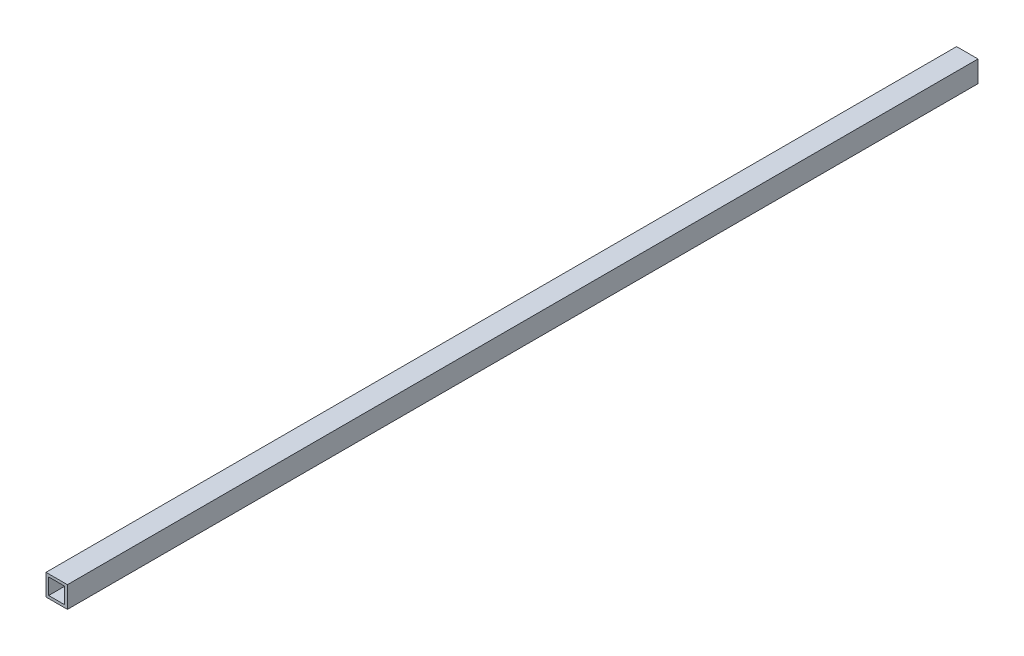
ISO-10303-21;
HEADER;
FILE_DESCRIPTION(('STEP AP214'),'2;1');
FILE_NAME('part.step','',(''),(''),'','','');
FILE_SCHEMA(('AUTOMOTIVE_DESIGN { 1 0 10303 214 1 1 1 1 }'));
ENDSEC;
DATA;
#1=APPLICATION_CONTEXT('core data for automotive mechanical design processes');
#2=APPLICATION_PROTOCOL_DEFINITION('international standard','automotive_design',2000,#1);
#3=PRODUCT_CONTEXT('',#1,'mechanical');
#4=PRODUCT('Part','Part','',(#3));
#5=PRODUCT_RELATED_PRODUCT_CATEGORY('part','',(#4));
#6=PRODUCT_DEFINITION_FORMATION('','',#4);
#7=PRODUCT_DEFINITION_CONTEXT('part definition',#1,'design');
#8=PRODUCT_DEFINITION('design','',#6,#7);
#9=PRODUCT_DEFINITION_SHAPE('','',#8);
#10=(LENGTH_UNIT() NAMED_UNIT(*) SI_UNIT(.MILLI.,.METRE.));
#11=(NAMED_UNIT(*) PLANE_ANGLE_UNIT() SI_UNIT($,.RADIAN.));
#12=(NAMED_UNIT(*) SI_UNIT($,.STERADIAN.) SOLID_ANGLE_UNIT());
#13=UNCERTAINTY_MEASURE_WITH_UNIT(LENGTH_MEASURE(1.E-05),#10,'distance_accuracy_value','');
#14=(GEOMETRIC_REPRESENTATION_CONTEXT(3) GLOBAL_UNCERTAINTY_ASSIGNED_CONTEXT((#13)) GLOBAL_UNIT_ASSIGNED_CONTEXT((#10,
#11,#12)) REPRESENTATION_CONTEXT('',''));
#15=CARTESIAN_POINT('',(0.,0.,0.));
#16=DIRECTION('',(0.,0.,1.));
#17=DIRECTION('',(1.,0.,0.));
#18=AXIS2_PLACEMENT_3D('',#15,#16,#17);
#19=CARTESIAN_POINT('',(-20.,-20.,1700.));
#20=DIRECTION('',(1.,0.,0.));
#21=DIRECTION('',(0.,0.,-1.));
#22=AXIS2_PLACEMENT_3D('',#19,#20,#21);
#23=PLANE('',#22);
#24=DIRECTION('',(0.,-1.,0.));
#25=VECTOR('',#24,1.);
#26=CARTESIAN_POINT('',(-20.,-20.,0.));
#27=LINE('',#26,#25);
#28=CARTESIAN_POINT('',(-20.,20.,0.));
#29=VERTEX_POINT('',#28);
#30=CARTESIAN_POINT('',(-20.,-20.,0.));
#31=VERTEX_POINT('',#30);
#32=EDGE_CURVE('E144',#29,#31,#27,.T.);
#33=ORIENTED_EDGE('',*,*,#32,.T.);
#34=DIRECTION('',(0.,0.,-1.));
#35=VECTOR('',#34,1.);
#36=CARTESIAN_POINT('',(-20.,-20.,1700.));
#37=LINE('',#36,#35);
#38=CARTESIAN_POINT('',(-20.,-20.,1700.));
#39=VERTEX_POINT('',#38);
#40=EDGE_CURVE('E11',#39,#31,#37,.T.);
#41=ORIENTED_EDGE('',*,*,#40,.F.);
#42=DIRECTION('',(0.,-1.,0.));
#43=VECTOR('',#42,1.);
#44=CARTESIAN_POINT('',(-20.,-20.,1700.));
#45=LINE('',#44,#43);
#46=CARTESIAN_POINT('',(-20.,20.,1700.));
#47=VERTEX_POINT('',#46);
#48=EDGE_CURVE('E133',#47,#39,#45,.T.);
#49=ORIENTED_EDGE('',*,*,#48,.F.);
#50=DIRECTION('',(0.,0.,-1.));
#51=VECTOR('',#50,1.);
#52=CARTESIAN_POINT('',(-20.,20.,1700.));
#53=LINE('',#52,#51);
#54=EDGE_CURVE('E143',#47,#29,#53,.T.);
#55=ORIENTED_EDGE('',*,*,#54,.T.);
#56=EDGE_LOOP('',(#33,#41,#49,#55));
#57=FACE_BOUND('',#56,.T.);
#58=ADVANCED_FACE('F36',(#57),#23,.F.);
#59=CARTESIAN_POINT('',(20.,-20.,1700.));
#60=DIRECTION('',(0.,1.,0.));
#61=DIRECTION('',(-1.,0.,0.));
#62=AXIS2_PLACEMENT_3D('',#59,#60,#61);
#63=PLANE('',#62);
#64=DIRECTION('',(1.,0.,0.));
#65=VECTOR('',#64,1.);
#66=CARTESIAN_POINT('',(20.,-20.,0.));
#67=LINE('',#66,#65);
#68=CARTESIAN_POINT('',(20.,-20.,0.));
#69=VERTEX_POINT('',#68);
#70=EDGE_CURVE('E147',#31,#69,#67,.T.);
#71=ORIENTED_EDGE('',*,*,#70,.T.);
#72=DIRECTION('',(0.,0.,-1.));
#73=VECTOR('',#72,1.);
#74=CARTESIAN_POINT('',(20.,-20.,1700.));
#75=LINE('',#74,#73);
#76=CARTESIAN_POINT('',(20.,-20.,1700.));
#77=VERTEX_POINT('',#76);
#78=EDGE_CURVE('E43',#77,#69,#75,.T.);
#79=ORIENTED_EDGE('',*,*,#78,.F.);
#80=DIRECTION('',(1.,0.,0.));
#81=VECTOR('',#80,1.);
#82=CARTESIAN_POINT('',(20.,-20.,1700.));
#83=LINE('',#82,#81);
#84=EDGE_CURVE('E136',#39,#77,#83,.T.);
#85=ORIENTED_EDGE('',*,*,#84,.F.);
#86=ORIENTED_EDGE('',*,*,#40,.T.);
#87=EDGE_LOOP('',(#71,#79,#85,#86));
#88=FACE_BOUND('',#87,.T.);
#89=ADVANCED_FACE('F175',(#88),#63,.F.);
#90=CARTESIAN_POINT('',(20.,-20.,1700.));
#91=DIRECTION('',(-1.,0.,0.));
#92=DIRECTION('',(0.,0.,1.));
#93=AXIS2_PLACEMENT_3D('',#90,#91,#92);
#94=PLANE('',#93);
#95=DIRECTION('',(0.,1.,0.));
#96=VECTOR('',#95,1.);
#97=CARTESIAN_POINT('',(20.,-20.,0.));
#98=LINE('',#97,#96);
#99=CARTESIAN_POINT('',(20.,20.,0.));
#100=VERTEX_POINT('',#99);
#101=EDGE_CURVE('E149',#69,#100,#98,.T.);
#102=ORIENTED_EDGE('',*,*,#101,.T.);
#103=DIRECTION('',(0.,0.,-1.));
#104=VECTOR('',#103,1.);
#105=CARTESIAN_POINT('',(20.,20.,1700.));
#106=LINE('',#105,#104);
#107=CARTESIAN_POINT('',(20.,20.,1700.));
#108=VERTEX_POINT('',#107);
#109=EDGE_CURVE('E154',#108,#100,#106,.T.);
#110=ORIENTED_EDGE('',*,*,#109,.F.);
#111=DIRECTION('',(0.,1.,0.));
#112=VECTOR('',#111,1.);
#113=CARTESIAN_POINT('',(20.,-20.,1700.));
#114=LINE('',#113,#112);
#115=EDGE_CURVE('E139',#77,#108,#114,.T.);
#116=ORIENTED_EDGE('',*,*,#115,.F.);
#117=ORIENTED_EDGE('',*,*,#78,.T.);
#118=EDGE_LOOP('',(#102,#110,#116,#117));
#119=FACE_BOUND('',#118,.T.);
#120=ADVANCED_FACE('F161',(#119),#94,.F.);
#121=CARTESIAN_POINT('',(20.,20.,1700.));
#122=DIRECTION('',(0.,-1.,0.));
#123=DIRECTION('',(1.,0.,0.));
#124=AXIS2_PLACEMENT_3D('',#121,#122,#123);
#125=PLANE('',#124);
#126=DIRECTION('',(-1.,0.,0.));
#127=VECTOR('',#126,1.);
#128=CARTESIAN_POINT('',(20.,20.,0.));
#129=LINE('',#128,#127);
#130=EDGE_CURVE('E137',#100,#29,#129,.T.);
#131=ORIENTED_EDGE('',*,*,#130,.T.);
#132=ORIENTED_EDGE('',*,*,#54,.F.);
#133=DIRECTION('',(-1.,0.,0.));
#134=VECTOR('',#133,1.);
#135=CARTESIAN_POINT('',(20.,20.,1700.));
#136=LINE('',#135,#134);
#137=EDGE_CURVE('E141',#108,#47,#136,.T.);
#138=ORIENTED_EDGE('',*,*,#137,.F.);
#139=ORIENTED_EDGE('',*,*,#109,.T.);
#140=EDGE_LOOP('',(#131,#132,#138,#139));
#141=FACE_BOUND('',#140,.T.);
#142=ADVANCED_FACE('F168',(#141),#125,.F.);
#143=CARTESIAN_POINT('',(0.,0.,1700.));
#144=DIRECTION('',(0.,0.,1.));
#145=DIRECTION('',(1.,0.,0.));
#146=AXIS2_PLACEMENT_3D('',#143,#144,#145);
#147=PLANE('',#146);
#148=DIRECTION('',(0.,-1.,0.));
#149=VECTOR('',#148,1.);
#150=CARTESIAN_POINT('',(-15.,-20.,1700.));
#151=LINE('',#150,#149);
#152=CARTESIAN_POINT('',(-15.,15.,1700.));
#153=VERTEX_POINT('',#152);
#154=CARTESIAN_POINT('',(-15.,-15.,1700.));
#155=VERTEX_POINT('',#154);
#156=EDGE_CURVE('E121',#153,#155,#151,.T.);
#157=ORIENTED_EDGE('',*,*,#156,.F.);
#158=DIRECTION('',(-1.,0.,0.));
#159=VECTOR('',#158,1.);
#160=CARTESIAN_POINT('',(20.,15.,1700.));
#161=LINE('',#160,#159);
#162=CARTESIAN_POINT('',(15.,15.,1700.));
#163=VERTEX_POINT('',#162);
#164=EDGE_CURVE('E105',#163,#153,#161,.T.);
#165=ORIENTED_EDGE('',*,*,#164,.F.);
#166=DIRECTION('',(0.,1.,0.));
#167=VECTOR('',#166,1.);
#168=CARTESIAN_POINT('',(15.,-20.,1700.));
#169=LINE('',#168,#167);
#170=CARTESIAN_POINT('',(15.,-15.,1700.));
#171=VERTEX_POINT('',#170);
#172=EDGE_CURVE('E130',#171,#163,#169,.T.);
#173=ORIENTED_EDGE('',*,*,#172,.F.);
#174=DIRECTION('',(1.,0.,0.));
#175=VECTOR('',#174,1.);
#176=CARTESIAN_POINT('',(20.,-15.,1700.));
#177=LINE('',#176,#175);
#178=EDGE_CURVE('E123',#155,#171,#177,.T.);
#179=ORIENTED_EDGE('',*,*,#178,.F.);
#180=EDGE_LOOP('',(#157,#165,#173,#179));
#181=FACE_BOUND('',#180,.T.);
#182=ORIENTED_EDGE('',*,*,#48,.T.);
#183=ORIENTED_EDGE('',*,*,#84,.T.);
#184=ORIENTED_EDGE('',*,*,#115,.T.);
#185=ORIENTED_EDGE('',*,*,#137,.T.);
#186=EDGE_LOOP('',(#182,#183,#184,#185));
#187=FACE_BOUND('',#186,.T.);
#188=ADVANCED_FACE('F174',(#181,#187),#147,.T.);
#189=CARTESIAN_POINT('',(0.,0.,0.));
#190=DIRECTION('',(0.,0.,1.));
#191=DIRECTION('',(1.,0.,0.));
#192=AXIS2_PLACEMENT_3D('',#189,#190,#191);
#193=PLANE('',#192);
#194=DIRECTION('',(-1.,0.,0.));
#195=VECTOR('',#194,1.);
#196=CARTESIAN_POINT('',(20.,15.,0.));
#197=LINE('',#196,#195);
#198=CARTESIAN_POINT('',(15.,15.,0.));
#199=VERTEX_POINT('',#198);
#200=CARTESIAN_POINT('',(-15.,15.,0.));
#201=VERTEX_POINT('',#200);
#202=EDGE_CURVE('E103',#199,#201,#197,.T.);
#203=ORIENTED_EDGE('',*,*,#202,.T.);
#204=DIRECTION('',(0.,-1.,0.));
#205=VECTOR('',#204,1.);
#206=CARTESIAN_POINT('',(-15.,-20.,0.));
#207=LINE('',#206,#205);
#208=CARTESIAN_POINT('',(-15.,-15.,0.));
#209=VERTEX_POINT('',#208);
#210=EDGE_CURVE('E111',#201,#209,#207,.T.);
#211=ORIENTED_EDGE('',*,*,#210,.T.);
#212=DIRECTION('',(1.,0.,0.));
#213=VECTOR('',#212,1.);
#214=CARTESIAN_POINT('',(20.,-15.,0.));
#215=LINE('',#214,#213);
#216=CARTESIAN_POINT('',(15.,-15.,0.));
#217=VERTEX_POINT('',#216);
#218=EDGE_CURVE('E117',#209,#217,#215,.T.);
#219=ORIENTED_EDGE('',*,*,#218,.T.);
#220=DIRECTION('',(0.,1.,0.));
#221=VECTOR('',#220,1.);
#222=CARTESIAN_POINT('',(15.,-20.,0.));
#223=LINE('',#222,#221);
#224=EDGE_CURVE('E57',#217,#199,#223,.T.);
#225=ORIENTED_EDGE('',*,*,#224,.T.);
#226=EDGE_LOOP('',(#203,#211,#219,#225));
#227=FACE_BOUND('',#226,.T.);
#228=ORIENTED_EDGE('',*,*,#32,.F.);
#229=ORIENTED_EDGE('',*,*,#130,.F.);
#230=ORIENTED_EDGE('',*,*,#101,.F.);
#231=ORIENTED_EDGE('',*,*,#70,.F.);
#232=EDGE_LOOP('',(#228,#229,#230,#231));
#233=FACE_BOUND('',#232,.T.);
#234=ADVANCED_FACE('F119',(#227,#233),#193,.F.);
#235=CARTESIAN_POINT('',(-15.,-20.,1700.));
#236=DIRECTION('',(1.,0.,0.));
#237=DIRECTION('',(0.,0.,-1.));
#238=AXIS2_PLACEMENT_3D('',#235,#236,#237);
#239=PLANE('',#238);
#240=ORIENTED_EDGE('',*,*,#210,.F.);
#241=DIRECTION('',(0.,0.,-1.));
#242=VECTOR('',#241,1.);
#243=CARTESIAN_POINT('',(-15.,15.,1700.));
#244=LINE('',#243,#242);
#245=EDGE_CURVE('E99',#153,#201,#244,.T.);
#246=ORIENTED_EDGE('',*,*,#245,.F.);
#247=ORIENTED_EDGE('',*,*,#156,.T.);
#248=DIRECTION('',(0.,0.,-1.));
#249=VECTOR('',#248,1.);
#250=CARTESIAN_POINT('',(-15.,-15.,1700.));
#251=LINE('',#250,#249);
#252=EDGE_CURVE('E114',#155,#209,#251,.T.);
#253=ORIENTED_EDGE('',*,*,#252,.T.);
#254=EDGE_LOOP('',(#240,#246,#247,#253));
#255=FACE_BOUND('',#254,.T.);
#256=ADVANCED_FACE('F112',(#255),#239,.T.);
#257=CARTESIAN_POINT('',(20.,-15.,1700.));
#258=DIRECTION('',(0.,1.,0.));
#259=DIRECTION('',(-1.,0.,0.));
#260=AXIS2_PLACEMENT_3D('',#257,#258,#259);
#261=PLANE('',#260);
#262=ORIENTED_EDGE('',*,*,#218,.F.);
#263=ORIENTED_EDGE('',*,*,#252,.F.);
#264=ORIENTED_EDGE('',*,*,#178,.T.);
#265=DIRECTION('',(0.,0.,-1.));
#266=VECTOR('',#265,1.);
#267=CARTESIAN_POINT('',(15.,-15.,1700.));
#268=LINE('',#267,#266);
#269=EDGE_CURVE('E259',#171,#217,#268,.T.);
#270=ORIENTED_EDGE('',*,*,#269,.T.);
#271=EDGE_LOOP('',(#262,#263,#264,#270));
#272=FACE_BOUND('',#271,.T.);
#273=ADVANCED_FACE('F195',(#272),#261,.T.);
#274=CARTESIAN_POINT('',(15.,-20.,1700.));
#275=DIRECTION('',(-1.,0.,0.));
#276=DIRECTION('',(0.,0.,1.));
#277=AXIS2_PLACEMENT_3D('',#274,#275,#276);
#278=PLANE('',#277);
#279=ORIENTED_EDGE('',*,*,#224,.F.);
#280=ORIENTED_EDGE('',*,*,#269,.F.);
#281=ORIENTED_EDGE('',*,*,#172,.T.);
#282=DIRECTION('',(0.,0.,-1.));
#283=VECTOR('',#282,1.);
#284=CARTESIAN_POINT('',(15.,15.,1700.));
#285=LINE('',#284,#283);
#286=EDGE_CURVE('E50',#163,#199,#285,.T.);
#287=ORIENTED_EDGE('',*,*,#286,.T.);
#288=EDGE_LOOP('',(#279,#280,#281,#287));
#289=FACE_BOUND('',#288,.T.);
#290=ADVANCED_FACE('F192',(#289),#278,.T.);
#291=CARTESIAN_POINT('',(20.,15.,1700.));
#292=DIRECTION('',(0.,-1.,0.));
#293=DIRECTION('',(1.,0.,0.));
#294=AXIS2_PLACEMENT_3D('',#291,#292,#293);
#295=PLANE('',#294);
#296=ORIENTED_EDGE('',*,*,#202,.F.);
#297=ORIENTED_EDGE('',*,*,#286,.F.);
#298=ORIENTED_EDGE('',*,*,#164,.T.);
#299=ORIENTED_EDGE('',*,*,#245,.T.);
#300=EDGE_LOOP('',(#296,#297,#298,#299));
#301=FACE_BOUND('',#300,.T.);
#302=ADVANCED_FACE('F101',(#301),#295,.T.);
#303=CLOSED_SHELL('',(#58,#89,#120,#142,#188,#234,#256,#273,#290,#302));
#304=MANIFOLD_SOLID_BREP('B2',#303);
#305=ADVANCED_BREP_SHAPE_REPRESENTATION('',(#18,#304),#14);
#306=SHAPE_DEFINITION_REPRESENTATION(#9,#305);
ENDSEC;
END-ISO-10303-21;
